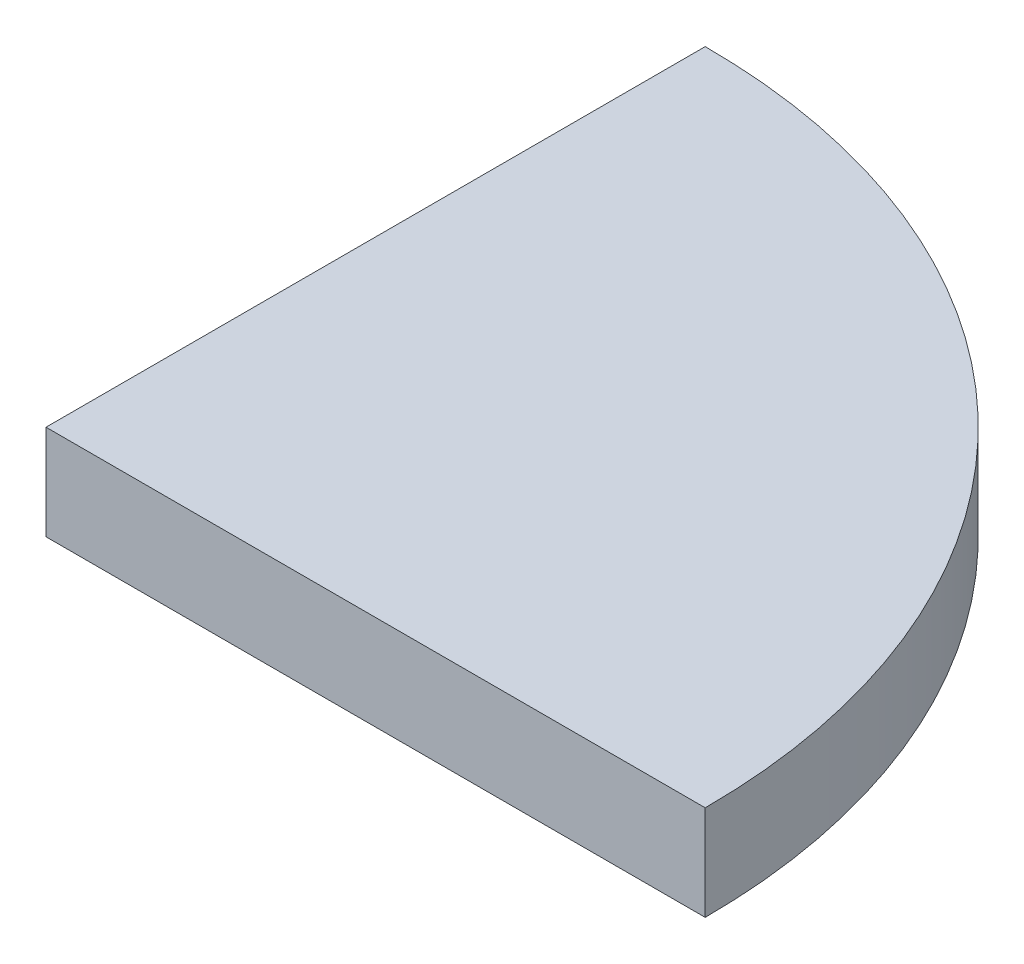
ISO-10303-21;
HEADER;
FILE_DESCRIPTION(('STEP AP214'),'2;1');
FILE_NAME('part.step','',(''),(''),'','','');
FILE_SCHEMA(('AUTOMOTIVE_DESIGN { 1 0 10303 214 1 1 1 1 }'));
ENDSEC;
DATA;
#1=APPLICATION_CONTEXT('core data for automotive mechanical design processes');
#2=APPLICATION_PROTOCOL_DEFINITION('international standard','automotive_design',2000,#1);
#3=PRODUCT_CONTEXT('',#1,'mechanical');
#4=PRODUCT('Part','Part','',(#3));
#5=PRODUCT_RELATED_PRODUCT_CATEGORY('part','',(#4));
#6=PRODUCT_DEFINITION_FORMATION('','',#4);
#7=PRODUCT_DEFINITION_CONTEXT('part definition',#1,'design');
#8=PRODUCT_DEFINITION('design','',#6,#7);
#9=PRODUCT_DEFINITION_SHAPE('','',#8);
#10=(LENGTH_UNIT() NAMED_UNIT(*) SI_UNIT(.MILLI.,.METRE.));
#11=(NAMED_UNIT(*) PLANE_ANGLE_UNIT() SI_UNIT($,.RADIAN.));
#12=(NAMED_UNIT(*) SI_UNIT($,.STERADIAN.) SOLID_ANGLE_UNIT());
#13=UNCERTAINTY_MEASURE_WITH_UNIT(LENGTH_MEASURE(1.E-05),#10,'distance_accuracy_value','');
#14=(GEOMETRIC_REPRESENTATION_CONTEXT(3) GLOBAL_UNCERTAINTY_ASSIGNED_CONTEXT((#13)) GLOBAL_UNIT_ASSIGNED_CONTEXT((#10,
#11,#12)) REPRESENTATION_CONTEXT('',''));
#15=CARTESIAN_POINT('',(0.,0.,0.));
#16=DIRECTION('',(0.,0.,1.));
#17=DIRECTION('',(1.,0.,0.));
#18=AXIS2_PLACEMENT_3D('',#15,#16,#17);
#19=CARTESIAN_POINT('',(0.,36.,26.4078871139554));
#20=DIRECTION('',(0.,0.,-1.));
#21=DIRECTION('',(-1.,0.,0.));
#22=AXIS2_PLACEMENT_3D('',#19,#20,#21);
#23=PLANE('',#22);
#24=DIRECTION('',(1.,0.,0.));
#25=VECTOR('',#24,1.);
#26=CARTESIAN_POINT('',(0.,0.,26.4078871139554));
#27=LINE('',#26,#25);
#28=CARTESIAN_POINT('',(-49.8815645485825,0.,26.4078871139554));
#29=VERTEX_POINT('',#28);
#30=CARTESIAN_POINT('',(200.118435451417,0.,26.4078871139554));
#31=VERTEX_POINT('',#30);
#32=EDGE_CURVE('E81',#29,#31,#27,.T.);
#33=ORIENTED_EDGE('',*,*,#32,.T.);
#34=DIRECTION('',(0.,-1.,0.));
#35=VECTOR('',#34,1.);
#36=CARTESIAN_POINT('',(200.118435451417,36.,26.4078871139554));
#37=LINE('',#36,#35);
#38=CARTESIAN_POINT('',(200.118435451417,36.,26.4078871139554));
#39=VERTEX_POINT('',#38);
#40=EDGE_CURVE('E11',#39,#31,#37,.T.);
#41=ORIENTED_EDGE('',*,*,#40,.F.);
#42=DIRECTION('',(1.,0.,0.));
#43=VECTOR('',#42,1.);
#44=CARTESIAN_POINT('',(0.,36.,26.4078871139554));
#45=LINE('',#44,#43);
#46=CARTESIAN_POINT('',(-49.8815645485825,36.,26.4078871139554));
#47=VERTEX_POINT('',#46);
#48=EDGE_CURVE('E74',#47,#39,#45,.T.);
#49=ORIENTED_EDGE('',*,*,#48,.F.);
#50=DIRECTION('',(0.,-1.,0.));
#51=VECTOR('',#50,1.);
#52=CARTESIAN_POINT('',(-49.8815645485825,36.,26.4078871139554));
#53=LINE('',#52,#51);
#54=EDGE_CURVE('E82',#47,#29,#53,.T.);
#55=ORIENTED_EDGE('',*,*,#54,.T.);
#56=EDGE_LOOP('',(#33,#41,#49,#55));
#57=FACE_BOUND('',#56,.T.);
#58=ADVANCED_FACE('F34',(#57),#23,.F.);
#59=CARTESIAN_POINT('',(-49.8815645485825,36.,26.4078871139554));
#60=DIRECTION('',(0.,-1.,0.));
#61=DIRECTION('',(0.,0.,-1.));
#62=AXIS2_PLACEMENT_3D('',#59,#60,#61);
#63=CYLINDRICAL_SURFACE('',#62,250.);
#64=CARTESIAN_POINT('',(-49.8815645485825,0.,26.4078871139554));
#65=DIRECTION('',(0.,1.,0.));
#66=DIRECTION('',(0.,0.,1.));
#67=AXIS2_PLACEMENT_3D('',#64,#65,#66);
#68=CIRCLE('',#67,250.);
#69=CARTESIAN_POINT('',(-49.8815645485825,0.,-223.592112886045));
#70=VERTEX_POINT('',#69);
#71=EDGE_CURVE('E62',#31,#70,#68,.T.);
#72=ORIENTED_EDGE('',*,*,#71,.T.);
#73=DIRECTION('',(0.,-1.,0.));
#74=VECTOR('',#73,1.);
#75=CARTESIAN_POINT('',(-49.8815645485825,36.,-223.592112886045));
#76=LINE('',#75,#74);
#77=CARTESIAN_POINT('',(-49.8815645485825,36.,-223.592112886045));
#78=VERTEX_POINT('',#77);
#79=EDGE_CURVE('E42',#78,#70,#76,.T.);
#80=ORIENTED_EDGE('',*,*,#79,.F.);
#81=CARTESIAN_POINT('',(-49.8815645485825,36.,26.4078871139554));
#82=DIRECTION('',(0.,1.,0.));
#83=DIRECTION('',(0.,0.,1.));
#84=AXIS2_PLACEMENT_3D('',#81,#82,#83);
#85=CIRCLE('',#84,250.);
#86=EDGE_CURVE('E70',#39,#78,#85,.T.);
#87=ORIENTED_EDGE('',*,*,#86,.F.);
#88=ORIENTED_EDGE('',*,*,#40,.T.);
#89=EDGE_LOOP('',(#72,#80,#87,#88));
#90=FACE_BOUND('',#89,.T.);
#91=ADVANCED_FACE('F71',(#90),#63,.T.);
#92=CARTESIAN_POINT('',(-49.8815645485825,36.,0.));
#93=DIRECTION('',(1.,0.,0.));
#94=DIRECTION('',(0.,0.,-1.));
#95=AXIS2_PLACEMENT_3D('',#92,#93,#94);
#96=PLANE('',#95);
#97=DIRECTION('',(0.,0.,1.));
#98=VECTOR('',#97,1.);
#99=CARTESIAN_POINT('',(-49.8815645485825,0.,0.));
#100=LINE('',#99,#98);
#101=EDGE_CURVE('E67',#70,#29,#100,.T.);
#102=ORIENTED_EDGE('',*,*,#101,.T.);
#103=ORIENTED_EDGE('',*,*,#54,.F.);
#104=DIRECTION('',(0.,0.,1.));
#105=VECTOR('',#104,1.);
#106=CARTESIAN_POINT('',(-49.8815645485825,36.,0.));
#107=LINE('',#106,#105);
#108=EDGE_CURVE('E50',#78,#47,#107,.T.);
#109=ORIENTED_EDGE('',*,*,#108,.F.);
#110=ORIENTED_EDGE('',*,*,#79,.T.);
#111=EDGE_LOOP('',(#102,#103,#109,#110));
#112=FACE_BOUND('',#111,.T.);
#113=ADVANCED_FACE('F89',(#112),#96,.F.);
#114=CARTESIAN_POINT('',(0.,36.,0.));
#115=DIRECTION('',(0.,1.,0.));
#116=DIRECTION('',(0.,0.,1.));
#117=AXIS2_PLACEMENT_3D('',#114,#115,#116);
#118=PLANE('',#117);
#119=ORIENTED_EDGE('',*,*,#48,.T.);
#120=ORIENTED_EDGE('',*,*,#86,.T.);
#121=ORIENTED_EDGE('',*,*,#108,.T.);
#122=EDGE_LOOP('',(#119,#120,#121));
#123=FACE_BOUND('',#122,.T.);
#124=ADVANCED_FACE('F77',(#123),#118,.T.);
#125=CARTESIAN_POINT('',(0.,0.,0.));
#126=DIRECTION('',(0.,1.,0.));
#127=DIRECTION('',(0.,0.,1.));
#128=AXIS2_PLACEMENT_3D('',#125,#126,#127);
#129=PLANE('',#128);
#130=ORIENTED_EDGE('',*,*,#32,.F.);
#131=ORIENTED_EDGE('',*,*,#101,.F.);
#132=ORIENTED_EDGE('',*,*,#71,.F.);
#133=EDGE_LOOP('',(#130,#131,#132));
#134=FACE_BOUND('',#133,.T.);
#135=ADVANCED_FACE('F90',(#134),#129,.F.);
#136=CLOSED_SHELL('',(#58,#91,#113,#124,#135));
#137=MANIFOLD_SOLID_BREP('B2',#136);
#138=ADVANCED_BREP_SHAPE_REPRESENTATION('',(#18,#137),#14);
#139=SHAPE_DEFINITION_REPRESENTATION(#9,#138);
ENDSEC;
END-ISO-10303-21;
